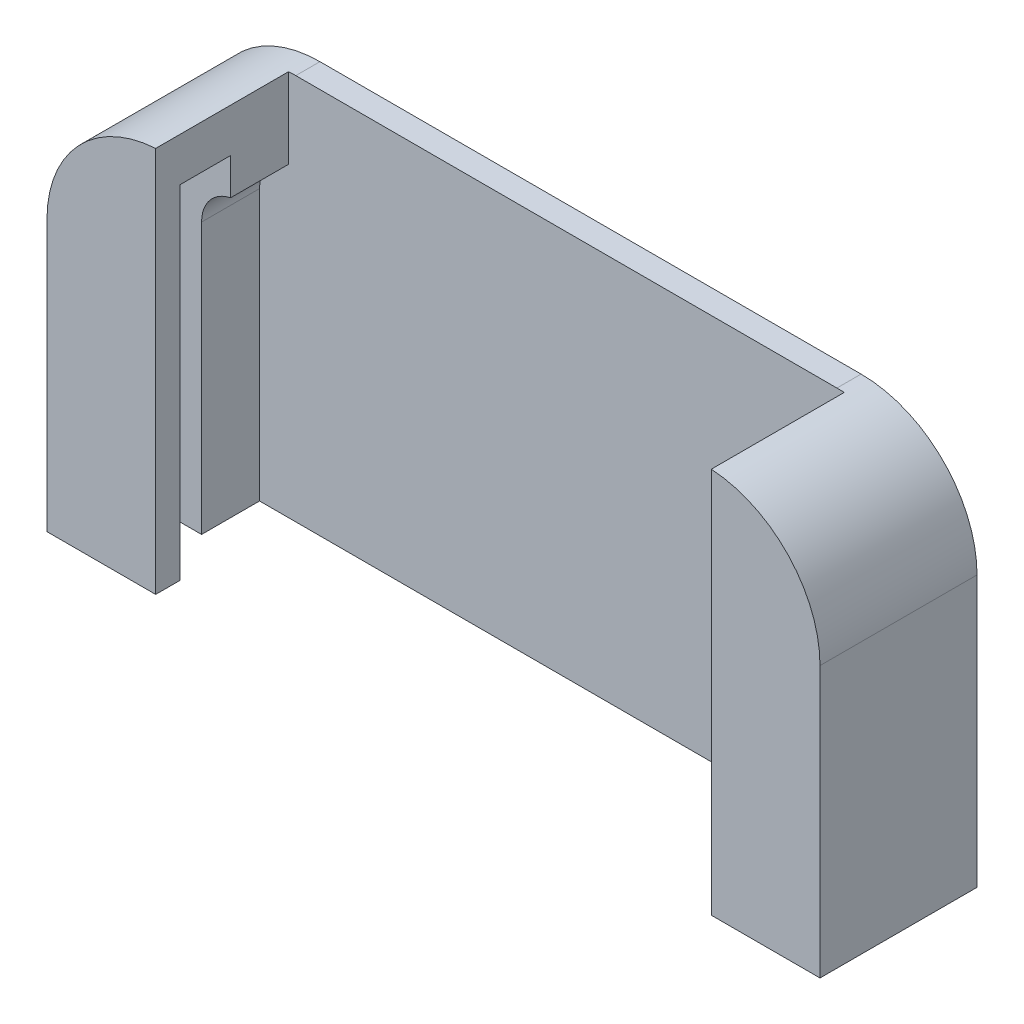
ISO-10303-21;
HEADER;
FILE_DESCRIPTION(('STEP AP214'),'2;1');
FILE_NAME('part.step','',(''),(''),'','','');
FILE_SCHEMA(('AUTOMOTIVE_DESIGN { 1 0 10303 214 1 1 1 1 }'));
ENDSEC;
DATA;
#1=APPLICATION_CONTEXT('core data for automotive mechanical design processes');
#2=APPLICATION_PROTOCOL_DEFINITION('international standard','automotive_design',2000,#1);
#3=PRODUCT_CONTEXT('',#1,'mechanical');
#4=PRODUCT('Part','Part','',(#3));
#5=PRODUCT_RELATED_PRODUCT_CATEGORY('part','',(#4));
#6=PRODUCT_DEFINITION_FORMATION('','',#4);
#7=PRODUCT_DEFINITION_CONTEXT('part definition',#1,'design');
#8=PRODUCT_DEFINITION('design','',#6,#7);
#9=PRODUCT_DEFINITION_SHAPE('','',#8);
#10=(LENGTH_UNIT() NAMED_UNIT(*) SI_UNIT(.MILLI.,.METRE.));
#11=(NAMED_UNIT(*) PLANE_ANGLE_UNIT() SI_UNIT($,.RADIAN.));
#12=(NAMED_UNIT(*) SI_UNIT($,.STERADIAN.) SOLID_ANGLE_UNIT());
#13=UNCERTAINTY_MEASURE_WITH_UNIT(LENGTH_MEASURE(1.E-05),#10,'distance_accuracy_value','');
#14=(GEOMETRIC_REPRESENTATION_CONTEXT(3) GLOBAL_UNCERTAINTY_ASSIGNED_CONTEXT((#13)) GLOBAL_UNIT_ASSIGNED_CONTEXT((#10,
#11,#12)) REPRESENTATION_CONTEXT('',''));
#15=CARTESIAN_POINT('',(0.,0.,0.));
#16=DIRECTION('',(0.,0.,1.));
#17=DIRECTION('',(1.,0.,0.));
#18=AXIS2_PLACEMENT_3D('',#15,#16,#17);
#19=CARTESIAN_POINT('',(4.8,11.2,3.4));
#20=DIRECTION('',(0.,0.,1.));
#21=DIRECTION('',(1.,0.,0.));
#22=AXIS2_PLACEMENT_3D('',#19,#20,#21);
#23=PLANE('',#22);
#24=DIRECTION('',(0.,1.,0.));
#25=VECTOR('',#24,1.);
#26=CARTESIAN_POINT('',(4.5,-0.00104999999999897,3.4));
#27=LINE('',#26,#25);
#28=CARTESIAN_POINT('',(4.5,12.6696938456699,3.4));
#29=VERTEX_POINT('',#28);
#30=CARTESIAN_POINT('',(4.5,14.1849623113199,3.4));
#31=VERTEX_POINT('',#30);
#32=EDGE_CURVE('E328',#29,#31,#27,.T.);
#33=ORIENTED_EDGE('',*,*,#32,.T.);
#34=CARTESIAN_POINT('',(4.8,11.2,3.4));
#35=DIRECTION('',(0.,0.,1.));
#36=DIRECTION('',(1.,0.,0.));
#37=AXIS2_PLACEMENT_3D('',#34,#35,#36);
#38=CIRCLE('',#37,3.);
#39=CARTESIAN_POINT('',(1.8,11.2,3.4));
#40=VERTEX_POINT('',#39);
#41=EDGE_CURVE('E191',#31,#40,#38,.T.);
#42=ORIENTED_EDGE('',*,*,#41,.T.);
#43=DIRECTION('',(0.,-1.,0.));
#44=VECTOR('',#43,1.);
#45=CARTESIAN_POINT('',(1.8,11.2,3.4));
#46=LINE('',#45,#44);
#47=CARTESIAN_POINT('',(1.8,0.,3.4));
#48=VERTEX_POINT('',#47);
#49=EDGE_CURVE('E228',#40,#48,#46,.T.);
#50=ORIENTED_EDGE('',*,*,#49,.T.);
#51=DIRECTION('',(1.,0.,0.));
#52=VECTOR('',#51,1.);
#53=CARTESIAN_POINT('',(1.8,0.,3.4));
#54=LINE('',#53,#52);
#55=CARTESIAN_POINT('',(3.3,0.,3.4));
#56=VERTEX_POINT('',#55);
#57=EDGE_CURVE('E231',#48,#56,#54,.T.);
#58=ORIENTED_EDGE('',*,*,#57,.T.);
#59=DIRECTION('',(0.,1.,0.));
#60=VECTOR('',#59,1.);
#61=CARTESIAN_POINT('',(3.3,11.2,3.4));
#62=LINE('',#61,#60);
#63=CARTESIAN_POINT('',(3.3,11.2,3.4));
#64=VERTEX_POINT('',#63);
#65=EDGE_CURVE('E233',#56,#64,#62,.T.);
#66=ORIENTED_EDGE('',*,*,#65,.T.);
#67=CARTESIAN_POINT('',(4.8,11.2,3.4));
#68=DIRECTION('',(0.,0.,-1.));
#69=DIRECTION('',(1.,0.,0.));
#70=AXIS2_PLACEMENT_3D('',#67,#68,#69);
#71=CIRCLE('',#70,1.5);
#72=EDGE_CURVE('E235',#64,#29,#71,.T.);
#73=ORIENTED_EDGE('',*,*,#72,.T.);
#74=EDGE_LOOP('',(#33,#42,#50,#58,#66,#73));
#75=FACE_BOUND('',#74,.T.);
#76=ADVANCED_FACE('F35',(#75),#23,.T.);
#77=CARTESIAN_POINT('',(4.8,11.2,1.));
#78=DIRECTION('',(0.,0.,-1.));
#79=DIRECTION('',(-1.,0.,0.));
#80=AXIS2_PLACEMENT_3D('',#77,#78,#79);
#81=PLANE('',#80);
#82=DIRECTION('',(0.,1.,0.));
#83=VECTOR('',#82,1.);
#84=CARTESIAN_POINT('',(3.3,11.2,1.));
#85=LINE('',#84,#83);
#86=CARTESIAN_POINT('',(3.3,0.,1.));
#87=VERTEX_POINT('',#86);
#88=CARTESIAN_POINT('',(3.3,11.2,1.));
#89=VERTEX_POINT('',#88);
#90=EDGE_CURVE('E224',#87,#89,#85,.T.);
#91=ORIENTED_EDGE('',*,*,#90,.F.);
#92=DIRECTION('',(1.,0.,0.));
#93=VECTOR('',#92,1.);
#94=CARTESIAN_POINT('',(1.8,0.,1.));
#95=LINE('',#94,#93);
#96=CARTESIAN_POINT('',(28.7,0.,1.));
#97=VERTEX_POINT('',#96);
#98=EDGE_CURVE('E273',#87,#97,#95,.T.);
#99=ORIENTED_EDGE('',*,*,#98,.T.);
#100=DIRECTION('',(0.,-1.,0.));
#101=VECTOR('',#100,1.);
#102=CARTESIAN_POINT('',(28.7,0.,1.));
#103=LINE('',#102,#101);
#104=CARTESIAN_POINT('',(28.7,11.2,1.));
#105=VERTEX_POINT('',#104);
#106=EDGE_CURVE('E229',#105,#97,#103,.T.);
#107=ORIENTED_EDGE('',*,*,#106,.F.);
#108=CARTESIAN_POINT('',(27.2,11.2,1.));
#109=DIRECTION('',(0.,0.,-1.));
#110=DIRECTION('',(1.,0.,0.));
#111=AXIS2_PLACEMENT_3D('',#108,#109,#110);
#112=CIRCLE('',#111,1.5);
#113=CARTESIAN_POINT('',(27.5,12.6696938456699,1.));
#114=VERTEX_POINT('',#113);
#115=EDGE_CURVE('E254',#114,#105,#112,.T.);
#116=ORIENTED_EDGE('',*,*,#115,.F.);
#117=DIRECTION('',(0.,1.,0.));
#118=VECTOR('',#117,1.);
#119=CARTESIAN_POINT('',(27.5,-0.00104999999999897,1.));
#120=LINE('',#119,#118);
#121=CARTESIAN_POINT('',(27.5,15.9906158268014,1.));
#122=VERTEX_POINT('',#121);
#123=EDGE_CURVE('E339',#114,#122,#120,.T.);
#124=ORIENTED_EDGE('',*,*,#123,.T.);
#125=CARTESIAN_POINT('',(27.2,11.2,1.));
#126=DIRECTION('',(0.,0.,-1.));
#127=DIRECTION('',(-1.,0.,0.));
#128=AXIS2_PLACEMENT_3D('',#125,#126,#127);
#129=CIRCLE('',#128,4.8);
#130=CARTESIAN_POINT('',(27.2,16.,1.));
#131=VERTEX_POINT('',#130);
#132=EDGE_CURVE('E195',#122,#131,#129,.F.);
#133=ORIENTED_EDGE('',*,*,#132,.T.);
#134=DIRECTION('',(-1.,0.,0.));
#135=VECTOR('',#134,1.);
#136=CARTESIAN_POINT('',(4.5,16.,1.));
#137=LINE('',#136,#135);
#138=CARTESIAN_POINT('',(4.8,16.,1.));
#139=VERTEX_POINT('',#138);
#140=EDGE_CURVE('E334',#131,#139,#137,.T.);
#141=ORIENTED_EDGE('',*,*,#140,.T.);
#142=CARTESIAN_POINT('',(4.8,11.2,1.));
#143=DIRECTION('',(0.,0.,-1.));
#144=DIRECTION('',(-1.,0.,0.));
#145=AXIS2_PLACEMENT_3D('',#142,#143,#144);
#146=CIRCLE('',#145,4.8);
#147=CARTESIAN_POINT('',(4.5,15.9906158268014,1.));
#148=VERTEX_POINT('',#147);
#149=EDGE_CURVE('E428',#139,#148,#146,.F.);
#150=ORIENTED_EDGE('',*,*,#149,.T.);
#151=DIRECTION('',(0.,1.,0.));
#152=VECTOR('',#151,1.);
#153=CARTESIAN_POINT('',(4.5,-0.00104999999999897,1.));
#154=LINE('',#153,#152);
#155=CARTESIAN_POINT('',(4.5,12.6696938456699,1.));
#156=VERTEX_POINT('',#155);
#157=EDGE_CURVE('E340',#156,#148,#154,.T.);
#158=ORIENTED_EDGE('',*,*,#157,.F.);
#159=CARTESIAN_POINT('',(4.8,11.2,1.));
#160=DIRECTION('',(0.,0.,-1.));
#161=DIRECTION('',(1.,0.,0.));
#162=AXIS2_PLACEMENT_3D('',#159,#160,#161);
#163=CIRCLE('',#162,1.5);
#164=EDGE_CURVE('E251',#89,#156,#163,.T.);
#165=ORIENTED_EDGE('',*,*,#164,.F.);
#166=EDGE_LOOP('',(#91,#99,#107,#116,#124,#133,#141,#150,#158,#165));
#167=FACE_BOUND('',#166,.T.);
#168=ADVANCED_FACE('F420',(#167),#81,.F.);
#169=CARTESIAN_POINT('',(0.,0.,5.5));
#170=DIRECTION('',(1.,0.,0.));
#171=DIRECTION('',(0.,0.,-1.));
#172=AXIS2_PLACEMENT_3D('',#169,#170,#171);
#173=PLANE('',#172);
#174=DIRECTION('',(0.,-1.,0.));
#175=VECTOR('',#174,1.);
#176=CARTESIAN_POINT('',(0.,0.,0.));
#177=LINE('',#176,#175);
#178=CARTESIAN_POINT('',(0.,11.2,0.));
#179=VERTEX_POINT('',#178);
#180=CARTESIAN_POINT('',(0.,0.,0.));
#181=VERTEX_POINT('',#180);
#182=EDGE_CURVE('E284',#179,#181,#177,.T.);
#183=ORIENTED_EDGE('',*,*,#182,.T.);
#184=DIRECTION('',(0.,0.,-1.));
#185=VECTOR('',#184,1.);
#186=CARTESIAN_POINT('',(0.,0.,5.5));
#187=LINE('',#186,#185);
#188=CARTESIAN_POINT('',(0.,0.,6.5));
#189=VERTEX_POINT('',#188);
#190=EDGE_CURVE('E12',#189,#181,#187,.T.);
#191=ORIENTED_EDGE('',*,*,#190,.F.);
#192=DIRECTION('',(0.,-1.,0.));
#193=VECTOR('',#192,1.);
#194=CARTESIAN_POINT('',(0.,11.2,6.5));
#195=LINE('',#194,#193);
#196=CARTESIAN_POINT('',(0.,11.2,6.5));
#197=VERTEX_POINT('',#196);
#198=EDGE_CURVE('E212',#197,#189,#195,.T.);
#199=ORIENTED_EDGE('',*,*,#198,.F.);
#200=DIRECTION('',(0.,0.,-1.));
#201=VECTOR('',#200,1.);
#202=CARTESIAN_POINT('',(0.,11.2,5.5));
#203=LINE('',#202,#201);
#204=EDGE_CURVE('E298',#197,#179,#203,.T.);
#205=ORIENTED_EDGE('',*,*,#204,.T.);
#206=EDGE_LOOP('',(#183,#191,#199,#205));
#207=FACE_BOUND('',#206,.T.);
#208=ADVANCED_FACE('F37',(#207),#173,.F.);
#209=CARTESIAN_POINT('',(0.,0.,5.5));
#210=DIRECTION('',(0.,1.,0.));
#211=DIRECTION('',(0.,0.,1.));
#212=AXIS2_PLACEMENT_3D('',#209,#210,#211);
#213=PLANE('',#212);
#214=ORIENTED_EDGE('',*,*,#98,.F.);
#215=DIRECTION('',(0.,0.,-1.));
#216=VECTOR('',#215,1.);
#217=CARTESIAN_POINT('',(3.3,0.,3.4));
#218=LINE('',#217,#216);
#219=EDGE_CURVE('E205',#56,#87,#218,.T.);
#220=ORIENTED_EDGE('',*,*,#219,.F.);
#221=ORIENTED_EDGE('',*,*,#57,.F.);
#222=DIRECTION('',(0.,0.,1.));
#223=VECTOR('',#222,1.);
#224=CARTESIAN_POINT('',(1.8,0.,-31.752165280497));
#225=LINE('',#224,#223);
#226=CARTESIAN_POINT('',(1.8,0.,5.5));
#227=VERTEX_POINT('',#226);
#228=EDGE_CURVE('E269',#48,#227,#225,.T.);
#229=ORIENTED_EDGE('',*,*,#228,.T.);
#230=DIRECTION('',(1.,0.,0.));
#231=VECTOR('',#230,1.);
#232=CARTESIAN_POINT('',(0.,0.,5.5));
#233=LINE('',#232,#231);
#234=CARTESIAN_POINT('',(4.5,0.,5.5));
#235=VERTEX_POINT('',#234);
#236=EDGE_CURVE('E213',#227,#235,#233,.T.);
#237=ORIENTED_EDGE('',*,*,#236,.T.);
#238=DIRECTION('',(0.,0.,-1.));
#239=VECTOR('',#238,1.);
#240=CARTESIAN_POINT('',(4.5,0.,6.5));
#241=LINE('',#240,#239);
#242=CARTESIAN_POINT('',(4.5,0.,6.5));
#243=VERTEX_POINT('',#242);
#244=EDGE_CURVE('E211',#243,#235,#241,.T.);
#245=ORIENTED_EDGE('',*,*,#244,.F.);
#246=DIRECTION('',(1.,0.,0.));
#247=VECTOR('',#246,1.);
#248=CARTESIAN_POINT('',(0.,0.,6.5));
#249=LINE('',#248,#247);
#250=EDGE_CURVE('E216',#189,#243,#249,.T.);
#251=ORIENTED_EDGE('',*,*,#250,.F.);
#252=ORIENTED_EDGE('',*,*,#190,.T.);
#253=DIRECTION('',(1.,0.,0.));
#254=VECTOR('',#253,1.);
#255=CARTESIAN_POINT('',(0.,0.,0.));
#256=LINE('',#255,#254);
#257=CARTESIAN_POINT('',(32.,0.,0.));
#258=VERTEX_POINT('',#257);
#259=EDGE_CURVE('E287',#181,#258,#256,.T.);
#260=ORIENTED_EDGE('',*,*,#259,.T.);
#261=DIRECTION('',(0.,0.,-1.));
#262=VECTOR('',#261,1.);
#263=CARTESIAN_POINT('',(32.,0.,5.5));
#264=LINE('',#263,#262);
#265=CARTESIAN_POINT('',(32.,0.,6.5));
#266=VERTEX_POINT('',#265);
#267=EDGE_CURVE('E44',#266,#258,#264,.T.);
#268=ORIENTED_EDGE('',*,*,#267,.F.);
#269=DIRECTION('',(1.,0.,0.));
#270=VECTOR('',#269,1.);
#271=CARTESIAN_POINT('',(27.5,0.,6.5));
#272=LINE('',#271,#270);
#273=CARTESIAN_POINT('',(27.5,0.,6.5));
#274=VERTEX_POINT('',#273);
#275=EDGE_CURVE('E351',#274,#266,#272,.T.);
#276=ORIENTED_EDGE('',*,*,#275,.F.);
#277=DIRECTION('',(0.,0.,-1.));
#278=VECTOR('',#277,1.);
#279=CARTESIAN_POINT('',(27.5,0.,6.5));
#280=LINE('',#279,#278);
#281=CARTESIAN_POINT('',(27.5,0.,5.5));
#282=VERTEX_POINT('',#281);
#283=EDGE_CURVE('E362',#274,#282,#280,.T.);
#284=ORIENTED_EDGE('',*,*,#283,.T.);
#285=DIRECTION('',(1.,0.,0.));
#286=VECTOR('',#285,1.);
#287=CARTESIAN_POINT('',(27.5,0.,5.5));
#288=LINE('',#287,#286);
#289=CARTESIAN_POINT('',(30.2,0.,5.5));
#290=VERTEX_POINT('',#289);
#291=EDGE_CURVE('E350',#282,#290,#288,.T.);
#292=ORIENTED_EDGE('',*,*,#291,.T.);
#293=DIRECTION('',(0.,0.,1.));
#294=VECTOR('',#293,1.);
#295=CARTESIAN_POINT('',(30.2,0.,-31.752165280497));
#296=LINE('',#295,#294);
#297=CARTESIAN_POINT('',(30.2,0.,3.4));
#298=VERTEX_POINT('',#297);
#299=EDGE_CURVE('E276',#298,#290,#296,.T.);
#300=ORIENTED_EDGE('',*,*,#299,.F.);
#301=DIRECTION('',(1.,0.,0.));
#302=VECTOR('',#301,1.);
#303=CARTESIAN_POINT('',(28.7,0.,3.4));
#304=LINE('',#303,#302);
#305=CARTESIAN_POINT('',(28.7,0.,3.4));
#306=VERTEX_POINT('',#305);
#307=EDGE_CURVE('E242',#306,#298,#304,.T.);
#308=ORIENTED_EDGE('',*,*,#307,.F.);
#309=DIRECTION('',(0.,0.,-1.));
#310=VECTOR('',#309,1.);
#311=CARTESIAN_POINT('',(28.7,0.,3.4));
#312=LINE('',#311,#310);
#313=EDGE_CURVE('E249',#306,#97,#312,.T.);
#314=ORIENTED_EDGE('',*,*,#313,.T.);
#315=EDGE_LOOP('',(#214,#220,#221,#229,#237,#245,#251,#252,#260,#268,#276,#284,#292,#300,#308,#314));
#316=FACE_BOUND('',#315,.T.);
#317=ADVANCED_FACE('F321',(#316),#213,.F.);
#318=CARTESIAN_POINT('',(32.,0.,5.5));
#319=DIRECTION('',(-1.,0.,0.));
#320=DIRECTION('',(0.,0.,1.));
#321=AXIS2_PLACEMENT_3D('',#318,#319,#320);
#322=PLANE('',#321);
#323=DIRECTION('',(0.,1.,0.));
#324=VECTOR('',#323,1.);
#325=CARTESIAN_POINT('',(32.,0.,0.));
#326=LINE('',#325,#324);
#327=CARTESIAN_POINT('',(32.,11.2,0.));
#328=VERTEX_POINT('',#327);
#329=EDGE_CURVE('E289',#258,#328,#326,.T.);
#330=ORIENTED_EDGE('',*,*,#329,.T.);
#331=DIRECTION('',(0.,0.,-1.));
#332=VECTOR('',#331,1.);
#333=CARTESIAN_POINT('',(32.,11.2,5.5));
#334=LINE('',#333,#332);
#335=CARTESIAN_POINT('',(32.,11.2,6.5));
#336=VERTEX_POINT('',#335);
#337=EDGE_CURVE('E304',#336,#328,#334,.T.);
#338=ORIENTED_EDGE('',*,*,#337,.F.);
#339=DIRECTION('',(0.,1.,0.));
#340=VECTOR('',#339,1.);
#341=CARTESIAN_POINT('',(32.,0.,6.5));
#342=LINE('',#341,#340);
#343=EDGE_CURVE('E354',#266,#336,#342,.T.);
#344=ORIENTED_EDGE('',*,*,#343,.F.);
#345=ORIENTED_EDGE('',*,*,#267,.T.);
#346=EDGE_LOOP('',(#330,#338,#344,#345));
#347=FACE_BOUND('',#346,.T.);
#348=ADVANCED_FACE('F384',(#347),#322,.F.);
#349=CARTESIAN_POINT('',(27.2,11.2,5.5));
#350=DIRECTION('',(0.,0.,-1.));
#351=DIRECTION('',(-1.,0.,0.));
#352=AXIS2_PLACEMENT_3D('',#349,#350,#351);
#353=CYLINDRICAL_SURFACE('',#352,4.8);
#354=DIRECTION('',(0.,0.,-1.));
#355=VECTOR('',#354,1.);
#356=CARTESIAN_POINT('',(27.2,16.,5.5));
#357=LINE('',#356,#355);
#358=CARTESIAN_POINT('',(27.2,16.,0.));
#359=VERTEX_POINT('',#358);
#360=EDGE_CURVE('E302',#131,#359,#357,.T.);
#361=ORIENTED_EDGE('',*,*,#360,.F.);
#362=ORIENTED_EDGE('',*,*,#132,.F.);
#363=DIRECTION('',(0.,0.,-1.));
#364=VECTOR('',#363,1.);
#365=CARTESIAN_POINT('',(27.5,15.9906158268014,6.5));
#366=LINE('',#365,#364);
#367=CARTESIAN_POINT('',(27.5,15.9906158268014,6.5));
#368=VERTEX_POINT('',#367);
#369=EDGE_CURVE('E218',#368,#122,#366,.T.);
#370=ORIENTED_EDGE('',*,*,#369,.F.);
#371=CARTESIAN_POINT('',(27.2,11.2,6.5));
#372=DIRECTION('',(0.,0.,1.));
#373=DIRECTION('',(1.,0.,0.));
#374=AXIS2_PLACEMENT_3D('',#371,#372,#373);
#375=CIRCLE('',#374,4.8);
#376=EDGE_CURVE('E358',#336,#368,#375,.T.);
#377=ORIENTED_EDGE('',*,*,#376,.F.);
#378=ORIENTED_EDGE('',*,*,#337,.T.);
#379=CARTESIAN_POINT('',(27.2,11.2,0.));
#380=DIRECTION('',(0.,0.,1.));
#381=DIRECTION('',(-1.,0.,0.));
#382=AXIS2_PLACEMENT_3D('',#379,#380,#381);
#383=CIRCLE('',#382,4.8);
#384=EDGE_CURVE('E291',#328,#359,#383,.T.);
#385=ORIENTED_EDGE('',*,*,#384,.T.);
#386=EDGE_LOOP('',(#361,#362,#370,#377,#378,#385));
#387=FACE_BOUND('',#386,.T.);
#388=ADVANCED_FACE('F390',(#387),#353,.T.);
#389=CARTESIAN_POINT('',(4.8,16.,5.5));
#390=DIRECTION('',(0.,-1.,0.));
#391=DIRECTION('',(0.,0.,-1.));
#392=AXIS2_PLACEMENT_3D('',#389,#390,#391);
#393=PLANE('',#392);
#394=DIRECTION('',(0.,0.,-1.));
#395=VECTOR('',#394,1.);
#396=CARTESIAN_POINT('',(4.8,16.,5.5));
#397=LINE('',#396,#395);
#398=CARTESIAN_POINT('',(4.8,16.,0.));
#399=VERTEX_POINT('',#398);
#400=EDGE_CURVE('E300',#139,#399,#397,.T.);
#401=ORIENTED_EDGE('',*,*,#400,.F.);
#402=ORIENTED_EDGE('',*,*,#140,.F.);
#403=ORIENTED_EDGE('',*,*,#360,.T.);
#404=DIRECTION('',(-1.,0.,0.));
#405=VECTOR('',#404,1.);
#406=CARTESIAN_POINT('',(4.8,16.,0.));
#407=LINE('',#406,#405);
#408=EDGE_CURVE('E294',#359,#399,#407,.T.);
#409=ORIENTED_EDGE('',*,*,#408,.T.);
#410=EDGE_LOOP('',(#401,#402,#403,#409));
#411=FACE_BOUND('',#410,.T.);
#412=ADVANCED_FACE('F434',(#411),#393,.F.);
#413=CARTESIAN_POINT('',(4.8,11.2,5.5));
#414=DIRECTION('',(0.,0.,-1.));
#415=DIRECTION('',(-1.,0.,0.));
#416=AXIS2_PLACEMENT_3D('',#413,#414,#415);
#417=CYLINDRICAL_SURFACE('',#416,4.8);
#418=DIRECTION('',(0.,0.,-1.));
#419=VECTOR('',#418,1.);
#420=CARTESIAN_POINT('',(4.5,15.9906158268014,6.5));
#421=LINE('',#420,#419);
#422=CARTESIAN_POINT('',(4.5,15.9906158268014,6.5));
#423=VERTEX_POINT('',#422);
#424=EDGE_CURVE('E225',#423,#148,#421,.T.);
#425=ORIENTED_EDGE('',*,*,#424,.T.);
#426=ORIENTED_EDGE('',*,*,#149,.F.);
#427=ORIENTED_EDGE('',*,*,#400,.T.);
#428=CARTESIAN_POINT('',(4.8,11.2,0.));
#429=DIRECTION('',(0.,0.,1.));
#430=DIRECTION('',(-1.,0.,0.));
#431=AXIS2_PLACEMENT_3D('',#428,#429,#430);
#432=CIRCLE('',#431,4.8);
#433=EDGE_CURVE('E60',#399,#179,#432,.T.);
#434=ORIENTED_EDGE('',*,*,#433,.T.);
#435=ORIENTED_EDGE('',*,*,#204,.F.);
#436=CARTESIAN_POINT('',(4.8,11.2,6.5));
#437=DIRECTION('',(0.,0.,1.));
#438=DIRECTION('',(1.,0.,0.));
#439=AXIS2_PLACEMENT_3D('',#436,#437,#438);
#440=CIRCLE('',#439,4.8);
#441=EDGE_CURVE('E310',#423,#197,#440,.T.);
#442=ORIENTED_EDGE('',*,*,#441,.F.);
#443=EDGE_LOOP('',(#425,#426,#427,#434,#435,#442));
#444=FACE_BOUND('',#443,.T.);
#445=ADVANCED_FACE('F435',(#444),#417,.T.);
#446=CARTESIAN_POINT('',(4.8,11.2,0.));
#447=DIRECTION('',(0.,0.,-1.));
#448=DIRECTION('',(-1.,0.,0.));
#449=AXIS2_PLACEMENT_3D('',#446,#447,#448);
#450=PLANE('',#449);
#451=ORIENTED_EDGE('',*,*,#182,.F.);
#452=ORIENTED_EDGE('',*,*,#433,.F.);
#453=ORIENTED_EDGE('',*,*,#408,.F.);
#454=ORIENTED_EDGE('',*,*,#384,.F.);
#455=ORIENTED_EDGE('',*,*,#329,.F.);
#456=ORIENTED_EDGE('',*,*,#259,.F.);
#457=EDGE_LOOP('',(#451,#452,#453,#454,#455,#456));
#458=FACE_BOUND('',#457,.T.);
#459=ADVANCED_FACE('F386',(#458),#450,.T.);
#460=CARTESIAN_POINT('',(1.8,11.2,-31.752165280497));
#461=DIRECTION('',(-1.,0.,0.));
#462=DIRECTION('',(0.,-1.,0.));
#463=AXIS2_PLACEMENT_3D('',#460,#461,#462);
#464=PLANE('',#463);
#465=ORIENTED_EDGE('',*,*,#228,.F.);
#466=ORIENTED_EDGE('',*,*,#49,.F.);
#467=DIRECTION('',(0.,0.,1.));
#468=VECTOR('',#467,1.);
#469=CARTESIAN_POINT('',(1.8,11.2,-31.752165280497));
#470=LINE('',#469,#468);
#471=CARTESIAN_POINT('',(1.8,11.2,5.5));
#472=VERTEX_POINT('',#471);
#473=EDGE_CURVE('E280',#40,#472,#470,.T.);
#474=ORIENTED_EDGE('',*,*,#473,.T.);
#475=DIRECTION('',(0.,-1.,0.));
#476=VECTOR('',#475,1.);
#477=CARTESIAN_POINT('',(1.8,11.2,5.5));
#478=LINE('',#477,#476);
#479=EDGE_CURVE('E204',#472,#227,#478,.T.);
#480=ORIENTED_EDGE('',*,*,#479,.T.);
#481=EDGE_LOOP('',(#465,#466,#474,#480));
#482=FACE_BOUND('',#481,.T.);
#483=ADVANCED_FACE('F317',(#482),#464,.F.);
#484=CARTESIAN_POINT('',(30.2,0.,-31.752165280497));
#485=DIRECTION('',(1.,0.,0.));
#486=DIRECTION('',(0.,0.,-1.));
#487=AXIS2_PLACEMENT_3D('',#484,#485,#486);
#488=PLANE('',#487);
#489=DIRECTION('',(0.,0.,1.));
#490=VECTOR('',#489,1.);
#491=CARTESIAN_POINT('',(30.2,11.2,-31.752165280497));
#492=LINE('',#491,#490);
#493=CARTESIAN_POINT('',(30.2,11.2,3.4));
#494=VERTEX_POINT('',#493);
#495=CARTESIAN_POINT('',(30.2,11.2,5.5));
#496=VERTEX_POINT('',#495);
#497=EDGE_CURVE('E277',#494,#496,#492,.T.);
#498=ORIENTED_EDGE('',*,*,#497,.F.);
#499=DIRECTION('',(0.,1.,0.));
#500=VECTOR('',#499,1.);
#501=CARTESIAN_POINT('',(30.2,0.,3.4));
#502=LINE('',#501,#500);
#503=EDGE_CURVE('E244',#298,#494,#502,.T.);
#504=ORIENTED_EDGE('',*,*,#503,.F.);
#505=ORIENTED_EDGE('',*,*,#299,.T.);
#506=DIRECTION('',(0.,1.,0.));
#507=VECTOR('',#506,1.);
#508=CARTESIAN_POINT('',(30.2,0.,5.5));
#509=LINE('',#508,#507);
#510=EDGE_CURVE('E270',#290,#496,#509,.T.);
#511=ORIENTED_EDGE('',*,*,#510,.T.);
#512=EDGE_LOOP('',(#498,#504,#505,#511));
#513=FACE_BOUND('',#512,.T.);
#514=ADVANCED_FACE('F404',(#513),#488,.F.);
#515=CARTESIAN_POINT('',(27.2,11.2,-31.752165280497));
#516=DIRECTION('',(0.,0.,1.));
#517=DIRECTION('',(1.,0.,0.));
#518=AXIS2_PLACEMENT_3D('',#515,#516,#517);
#519=CYLINDRICAL_SURFACE('',#518,3.);
#520=CARTESIAN_POINT('',(27.2,11.2,5.5));
#521=DIRECTION('',(0.,0.,1.));
#522=DIRECTION('',(1.,0.,0.));
#523=AXIS2_PLACEMENT_3D('',#520,#521,#522);
#524=CIRCLE('',#523,3.);
#525=CARTESIAN_POINT('',(27.5,14.1849623113199,5.5));
#526=VERTEX_POINT('',#525);
#527=EDGE_CURVE('E266',#496,#526,#524,.T.);
#528=ORIENTED_EDGE('',*,*,#527,.T.);
#529=DIRECTION('',(0.,0.,1.));
#530=VECTOR('',#529,1.);
#531=CARTESIAN_POINT('',(27.5,14.1849623113199,-31.752165280497));
#532=LINE('',#531,#530);
#533=CARTESIAN_POINT('',(27.5,14.1849623113199,3.4));
#534=VERTEX_POINT('',#533);
#535=EDGE_CURVE('E52',#534,#526,#532,.T.);
#536=ORIENTED_EDGE('',*,*,#535,.F.);
#537=CARTESIAN_POINT('',(27.2,11.2,3.4));
#538=DIRECTION('',(0.,0.,1.));
#539=DIRECTION('',(1.,0.,0.));
#540=AXIS2_PLACEMENT_3D('',#537,#538,#539);
#541=CIRCLE('',#540,3.);
#542=EDGE_CURVE('E246',#494,#534,#541,.T.);
#543=ORIENTED_EDGE('',*,*,#542,.F.);
#544=ORIENTED_EDGE('',*,*,#497,.T.);
#545=EDGE_LOOP('',(#528,#536,#543,#544));
#546=FACE_BOUND('',#545,.T.);
#547=ADVANCED_FACE('F470',(#546),#519,.F.);
#548=CARTESIAN_POINT('',(4.8,11.2,-31.752165280497));
#549=DIRECTION('',(0.,0.,1.));
#550=DIRECTION('',(1.,0.,0.));
#551=AXIS2_PLACEMENT_3D('',#548,#549,#550);
#552=CYLINDRICAL_SURFACE('',#551,3.);
#553=ORIENTED_EDGE('',*,*,#41,.F.);
#554=DIRECTION('',(0.,0.,1.));
#555=VECTOR('',#554,1.);
#556=CARTESIAN_POINT('',(4.5,14.1849623113199,-31.752165280497));
#557=LINE('',#556,#555);
#558=CARTESIAN_POINT('',(4.5,14.1849623113199,5.5));
#559=VERTEX_POINT('',#558);
#560=EDGE_CURVE('E185',#559,#31,#557,.F.);
#561=ORIENTED_EDGE('',*,*,#560,.F.);
#562=CARTESIAN_POINT('',(4.8,11.2,5.5));
#563=DIRECTION('',(0.,0.,1.));
#564=DIRECTION('',(1.,0.,0.));
#565=AXIS2_PLACEMENT_3D('',#562,#563,#564);
#566=CIRCLE('',#565,3.);
#567=EDGE_CURVE('E189',#559,#472,#566,.T.);
#568=ORIENTED_EDGE('',*,*,#567,.T.);
#569=ORIENTED_EDGE('',*,*,#473,.F.);
#570=EDGE_LOOP('',(#553,#561,#568,#569));
#571=FACE_BOUND('',#570,.T.);
#572=ADVANCED_FACE('F187',(#571),#552,.F.);
#573=CARTESIAN_POINT('',(3.3,11.2,3.4));
#574=DIRECTION('',(-1.,0.,0.));
#575=DIRECTION('',(0.,-1.,0.));
#576=AXIS2_PLACEMENT_3D('',#573,#574,#575);
#577=PLANE('',#576);
#578=ORIENTED_EDGE('',*,*,#90,.T.);
#579=DIRECTION('',(0.,0.,-1.));
#580=VECTOR('',#579,1.);
#581=CARTESIAN_POINT('',(3.3,11.2,3.4));
#582=LINE('',#581,#580);
#583=EDGE_CURVE('E262',#64,#89,#582,.T.);
#584=ORIENTED_EDGE('',*,*,#583,.F.);
#585=ORIENTED_EDGE('',*,*,#65,.F.);
#586=ORIENTED_EDGE('',*,*,#219,.T.);
#587=EDGE_LOOP('',(#578,#584,#585,#586));
#588=FACE_BOUND('',#587,.T.);
#589=ADVANCED_FACE('F423',(#588),#577,.F.);
#590=CARTESIAN_POINT('',(4.8,11.2,3.4));
#591=DIRECTION('',(0.,0.,-1.));
#592=DIRECTION('',(-1.,0.,0.));
#593=AXIS2_PLACEMENT_3D('',#590,#591,#592);
#594=CYLINDRICAL_SURFACE('',#593,1.5);
#595=ORIENTED_EDGE('',*,*,#164,.T.);
#596=DIRECTION('',(0.,0.,-1.));
#597=VECTOR('',#596,1.);
#598=CARTESIAN_POINT('',(4.5,12.6696938456699,3.4));
#599=LINE('',#598,#597);
#600=EDGE_CURVE('E332',#29,#156,#599,.T.);
#601=ORIENTED_EDGE('',*,*,#600,.F.);
#602=ORIENTED_EDGE('',*,*,#72,.F.);
#603=ORIENTED_EDGE('',*,*,#583,.T.);
#604=EDGE_LOOP('',(#595,#601,#602,#603));
#605=FACE_BOUND('',#604,.T.);
#606=ADVANCED_FACE('F425',(#605),#594,.F.);
#607=CARTESIAN_POINT('',(27.2,11.2,3.4));
#608=DIRECTION('',(0.,0.,-1.));
#609=DIRECTION('',(-1.,0.,0.));
#610=AXIS2_PLACEMENT_3D('',#607,#608,#609);
#611=CYLINDRICAL_SURFACE('',#610,1.5);
#612=CARTESIAN_POINT('',(27.2,11.2,3.4));
#613=DIRECTION('',(0.,0.,-1.));
#614=DIRECTION('',(1.,0.,0.));
#615=AXIS2_PLACEMENT_3D('',#612,#613,#614);
#616=CIRCLE('',#615,1.5);
#617=CARTESIAN_POINT('',(27.5,12.6696938456699,3.4));
#618=VERTEX_POINT('',#617);
#619=CARTESIAN_POINT('',(28.7,11.2,3.4));
#620=VERTEX_POINT('',#619);
#621=EDGE_CURVE('E238',#618,#620,#616,.T.);
#622=ORIENTED_EDGE('',*,*,#621,.F.);
#623=DIRECTION('',(0.,0.,-1.));
#624=VECTOR('',#623,1.);
#625=CARTESIAN_POINT('',(27.5,12.6696938456699,3.4));
#626=LINE('',#625,#624);
#627=EDGE_CURVE('E348',#114,#618,#626,.F.);
#628=ORIENTED_EDGE('',*,*,#627,.F.);
#629=ORIENTED_EDGE('',*,*,#115,.T.);
#630=DIRECTION('',(0.,0.,-1.));
#631=VECTOR('',#630,1.);
#632=CARTESIAN_POINT('',(28.7,11.2,3.4));
#633=LINE('',#632,#631);
#634=EDGE_CURVE('E259',#620,#105,#633,.T.);
#635=ORIENTED_EDGE('',*,*,#634,.F.);
#636=EDGE_LOOP('',(#622,#628,#629,#635));
#637=FACE_BOUND('',#636,.T.);
#638=ADVANCED_FACE('F457',(#637),#611,.F.);
#639=CARTESIAN_POINT('',(28.7,0.,3.4));
#640=DIRECTION('',(1.,0.,0.));
#641=DIRECTION('',(0.,0.,-1.));
#642=AXIS2_PLACEMENT_3D('',#639,#640,#641);
#643=PLANE('',#642);
#644=ORIENTED_EDGE('',*,*,#106,.T.);
#645=ORIENTED_EDGE('',*,*,#313,.F.);
#646=DIRECTION('',(0.,-1.,0.));
#647=VECTOR('',#646,1.);
#648=CARTESIAN_POINT('',(28.7,0.,3.4));
#649=LINE('',#648,#647);
#650=EDGE_CURVE('E240',#620,#306,#649,.T.);
#651=ORIENTED_EDGE('',*,*,#650,.F.);
#652=ORIENTED_EDGE('',*,*,#634,.T.);
#653=EDGE_LOOP('',(#644,#645,#651,#652));
#654=FACE_BOUND('',#653,.T.);
#655=ADVANCED_FACE('F415',(#654),#643,.F.);
#656=DIRECTION('',(0.,-1.,0.));
#657=VECTOR('',#656,1.);
#658=CARTESIAN_POINT('',(27.5,-0.00104999999999897,3.4));
#659=LINE('',#658,#657);
#660=EDGE_CURVE('E343',#534,#618,#659,.T.);
#661=ORIENTED_EDGE('',*,*,#660,.T.);
#662=ORIENTED_EDGE('',*,*,#621,.T.);
#663=ORIENTED_EDGE('',*,*,#650,.T.);
#664=ORIENTED_EDGE('',*,*,#307,.T.);
#665=ORIENTED_EDGE('',*,*,#503,.T.);
#666=ORIENTED_EDGE('',*,*,#542,.T.);
#667=EDGE_LOOP('',(#661,#662,#663,#664,#665,#666));
#668=FACE_BOUND('',#667,.T.);
#669=ADVANCED_FACE('F409',(#668),#23,.T.);
#670=CARTESIAN_POINT('',(4.5,0.,6.5));
#671=DIRECTION('',(-1.,0.,0.));
#672=DIRECTION('',(0.,-1.,0.));
#673=AXIS2_PLACEMENT_3D('',#670,#671,#672);
#674=PLANE('',#673);
#675=DIRECTION('',(0.,1.,0.));
#676=VECTOR('',#675,1.);
#677=CARTESIAN_POINT('',(4.5,0.,5.5));
#678=LINE('',#677,#676);
#679=EDGE_CURVE('E202',#235,#559,#678,.T.);
#680=ORIENTED_EDGE('',*,*,#679,.T.);
#681=ORIENTED_EDGE('',*,*,#560,.T.);
#682=ORIENTED_EDGE('',*,*,#32,.F.);
#683=ORIENTED_EDGE('',*,*,#600,.T.);
#684=ORIENTED_EDGE('',*,*,#157,.T.);
#685=ORIENTED_EDGE('',*,*,#424,.F.);
#686=DIRECTION('',(0.,1.,0.));
#687=VECTOR('',#686,1.);
#688=CARTESIAN_POINT('',(4.5,0.,6.5));
#689=LINE('',#688,#687);
#690=EDGE_CURVE('E370',#243,#423,#689,.T.);
#691=ORIENTED_EDGE('',*,*,#690,.F.);
#692=ORIENTED_EDGE('',*,*,#244,.T.);
#693=EDGE_LOOP('',(#680,#681,#682,#683,#684,#685,#691,#692));
#694=FACE_BOUND('',#693,.T.);
#695=ADVANCED_FACE('F208',(#694),#674,.F.);
#696=CARTESIAN_POINT('',(4.8,11.2,6.5));
#697=DIRECTION('',(0.,0.,1.));
#698=DIRECTION('',(1.,0.,0.));
#699=AXIS2_PLACEMENT_3D('',#696,#697,#698);
#700=PLANE('',#699);
#701=ORIENTED_EDGE('',*,*,#198,.T.);
#702=ORIENTED_EDGE('',*,*,#250,.T.);
#703=ORIENTED_EDGE('',*,*,#690,.T.);
#704=ORIENTED_EDGE('',*,*,#441,.T.);
#705=EDGE_LOOP('',(#701,#702,#703,#704));
#706=FACE_BOUND('',#705,.T.);
#707=ADVANCED_FACE('F375',(#706),#700,.T.);
#708=CARTESIAN_POINT('',(4.8,11.2,5.5));
#709=DIRECTION('',(0.,0.,1.));
#710=DIRECTION('',(1.,0.,0.));
#711=AXIS2_PLACEMENT_3D('',#708,#709,#710);
#712=PLANE('',#711);
#713=ORIENTED_EDGE('',*,*,#479,.F.);
#714=ORIENTED_EDGE('',*,*,#567,.F.);
#715=ORIENTED_EDGE('',*,*,#679,.F.);
#716=ORIENTED_EDGE('',*,*,#236,.F.);
#717=EDGE_LOOP('',(#713,#714,#715,#716));
#718=FACE_BOUND('',#717,.T.);
#719=ADVANCED_FACE('F200',(#718),#712,.F.);
#720=CARTESIAN_POINT('',(27.2,11.2,5.5));
#721=DIRECTION('',(0.,0.,1.));
#722=DIRECTION('',(1.,0.,0.));
#723=AXIS2_PLACEMENT_3D('',#720,#721,#722);
#724=PLANE('',#723);
#725=ORIENTED_EDGE('',*,*,#527,.F.);
#726=ORIENTED_EDGE('',*,*,#510,.F.);
#727=ORIENTED_EDGE('',*,*,#291,.F.);
#728=DIRECTION('',(0.,-1.,0.));
#729=VECTOR('',#728,1.);
#730=CARTESIAN_POINT('',(27.5,15.9906158268014,5.5));
#731=LINE('',#730,#729);
#732=EDGE_CURVE('E355',#526,#282,#731,.T.);
#733=ORIENTED_EDGE('',*,*,#732,.F.);
#734=EDGE_LOOP('',(#725,#726,#727,#733));
#735=FACE_BOUND('',#734,.T.);
#736=ADVANCED_FACE('F401',(#735),#724,.F.);
#737=CARTESIAN_POINT('',(27.5,15.9906158268014,6.5));
#738=DIRECTION('',(1.,0.,0.));
#739=DIRECTION('',(0.,0.,-1.));
#740=AXIS2_PLACEMENT_3D('',#737,#738,#739);
#741=PLANE('',#740);
#742=ORIENTED_EDGE('',*,*,#369,.T.);
#743=ORIENTED_EDGE('',*,*,#123,.F.);
#744=ORIENTED_EDGE('',*,*,#627,.T.);
#745=ORIENTED_EDGE('',*,*,#660,.F.);
#746=ORIENTED_EDGE('',*,*,#535,.T.);
#747=ORIENTED_EDGE('',*,*,#732,.T.);
#748=ORIENTED_EDGE('',*,*,#283,.F.);
#749=DIRECTION('',(0.,-1.,0.));
#750=VECTOR('',#749,1.);
#751=CARTESIAN_POINT('',(27.5,15.9906158268014,6.5));
#752=LINE('',#751,#750);
#753=EDGE_CURVE('E360',#368,#274,#752,.T.);
#754=ORIENTED_EDGE('',*,*,#753,.F.);
#755=EDGE_LOOP('',(#742,#743,#744,#745,#746,#747,#748,#754));
#756=FACE_BOUND('',#755,.T.);
#757=ADVANCED_FACE('F541',(#756),#741,.F.);
#758=CARTESIAN_POINT('',(27.2,11.2,6.5));
#759=DIRECTION('',(0.,0.,1.));
#760=DIRECTION('',(1.,0.,0.));
#761=AXIS2_PLACEMENT_3D('',#758,#759,#760);
#762=PLANE('',#761);
#763=ORIENTED_EDGE('',*,*,#275,.T.);
#764=ORIENTED_EDGE('',*,*,#343,.T.);
#765=ORIENTED_EDGE('',*,*,#376,.T.);
#766=ORIENTED_EDGE('',*,*,#753,.T.);
#767=EDGE_LOOP('',(#763,#764,#765,#766));
#768=FACE_BOUND('',#767,.T.);
#769=ADVANCED_FACE('F395',(#768),#762,.T.);
#770=CLOSED_SHELL('',(#76,#168,#208,#317,#348,#388,#412,#445,#459,#483,#514,#547,#572,#589,#606,
#638,#655,#669,#695,#707,#719,#736,#757,#769));
#771=MANIFOLD_SOLID_BREP('B2',#770);
#772=ADVANCED_BREP_SHAPE_REPRESENTATION('',(#18,#771),#14);
#773=SHAPE_DEFINITION_REPRESENTATION(#9,#772);
ENDSEC;
END-ISO-10303-21;
